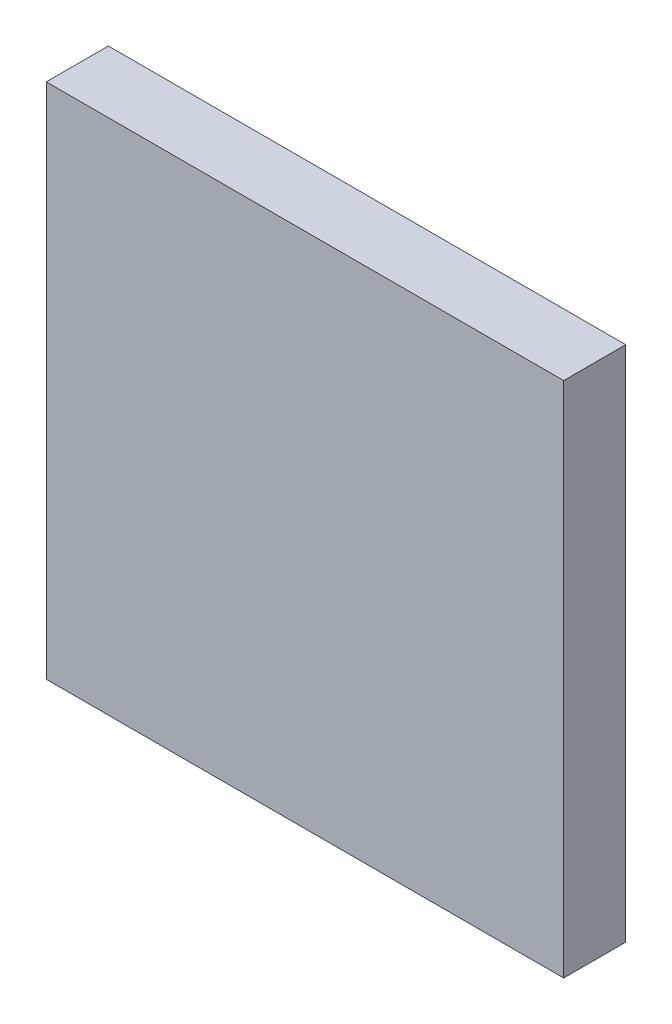
ISO-10303-21;
HEADER;
FILE_DESCRIPTION(('STEP AP214'),'2;1');
FILE_NAME('part.step','',(''),(''),'','','');
FILE_SCHEMA(('AUTOMOTIVE_DESIGN { 1 0 10303 214 1 1 1 1 }'));
ENDSEC;
DATA;
#1=APPLICATION_CONTEXT('core data for automotive mechanical design processes');
#2=APPLICATION_PROTOCOL_DEFINITION('international standard','automotive_design',2000,#1);
#3=PRODUCT_CONTEXT('',#1,'mechanical');
#4=PRODUCT('Part','Part','',(#3));
#5=PRODUCT_RELATED_PRODUCT_CATEGORY('part','',(#4));
#6=PRODUCT_DEFINITION_FORMATION('','',#4);
#7=PRODUCT_DEFINITION_CONTEXT('part definition',#1,'design');
#8=PRODUCT_DEFINITION('design','',#6,#7);
#9=PRODUCT_DEFINITION_SHAPE('','',#8);
#10=(LENGTH_UNIT() NAMED_UNIT(*) SI_UNIT(.MILLI.,.METRE.));
#11=(NAMED_UNIT(*) PLANE_ANGLE_UNIT() SI_UNIT($,.RADIAN.));
#12=(NAMED_UNIT(*) SI_UNIT($,.STERADIAN.) SOLID_ANGLE_UNIT());
#13=UNCERTAINTY_MEASURE_WITH_UNIT(LENGTH_MEASURE(1.E-05),#10,'distance_accuracy_value','');
#14=(GEOMETRIC_REPRESENTATION_CONTEXT(3) GLOBAL_UNCERTAINTY_ASSIGNED_CONTEXT((#13)) GLOBAL_UNIT_ASSIGNED_CONTEXT((#10,
#11,#12)) REPRESENTATION_CONTEXT('',''));
#15=CARTESIAN_POINT('',(0.,0.,0.));
#16=DIRECTION('',(0.,0.,1.));
#17=DIRECTION('',(1.,0.,0.));
#18=AXIS2_PLACEMENT_3D('',#15,#16,#17);
#19=CARTESIAN_POINT('',(0.,0.,3.));
#20=DIRECTION('',(1.,0.,0.));
#21=DIRECTION('',(0.,0.,-1.));
#22=AXIS2_PLACEMENT_3D('',#19,#20,#21);
#23=PLANE('',#22);
#24=DIRECTION('',(0.,-1.,0.));
#25=VECTOR('',#24,1.);
#26=CARTESIAN_POINT('',(0.,0.,0.));
#27=LINE('',#26,#25);
#28=CARTESIAN_POINT('',(0.,0.,0.));
#29=VERTEX_POINT('',#28);
#30=CARTESIAN_POINT('',(0.,-25.,0.));
#31=VERTEX_POINT('',#30);
#32=EDGE_CURVE('E107',#29,#31,#27,.T.);
#33=ORIENTED_EDGE('',*,*,#32,.T.);
#34=DIRECTION('',(0.,0.,-1.));
#35=VECTOR('',#34,1.);
#36=CARTESIAN_POINT('',(0.,-25.,3.));
#37=LINE('',#36,#35);
#38=CARTESIAN_POINT('',(0.,-25.,3.));
#39=VERTEX_POINT('',#38);
#40=EDGE_CURVE('E11',#39,#31,#37,.T.);
#41=ORIENTED_EDGE('',*,*,#40,.F.);
#42=DIRECTION('',(0.,-1.,0.));
#43=VECTOR('',#42,1.);
#44=CARTESIAN_POINT('',(0.,0.,3.));
#45=LINE('',#44,#43);
#46=CARTESIAN_POINT('',(0.,0.,3.));
#47=VERTEX_POINT('',#46);
#48=EDGE_CURVE('E91',#47,#39,#45,.T.);
#49=ORIENTED_EDGE('',*,*,#48,.F.);
#50=DIRECTION('',(0.,0.,-1.));
#51=VECTOR('',#50,1.);
#52=CARTESIAN_POINT('',(0.,0.,3.));
#53=LINE('',#52,#51);
#54=EDGE_CURVE('E103',#47,#29,#53,.T.);
#55=ORIENTED_EDGE('',*,*,#54,.T.);
#56=EDGE_LOOP('',(#33,#41,#49,#55));
#57=FACE_BOUND('',#56,.T.);
#58=ADVANCED_FACE('F39',(#57),#23,.F.);
#59=CARTESIAN_POINT('',(0.,-25.,3.));
#60=DIRECTION('',(0.,1.,0.));
#61=DIRECTION('',(0.,0.,1.));
#62=AXIS2_PLACEMENT_3D('',#59,#60,#61);
#63=PLANE('',#62);
#64=DIRECTION('',(1.,0.,0.));
#65=VECTOR('',#64,1.);
#66=CARTESIAN_POINT('',(0.,-25.,0.));
#67=LINE('',#66,#65);
#68=CARTESIAN_POINT('',(25.,-25.,0.));
#69=VERTEX_POINT('',#68);
#70=EDGE_CURVE('E96',#31,#69,#67,.T.);
#71=ORIENTED_EDGE('',*,*,#70,.T.);
#72=DIRECTION('',(0.,0.,-1.));
#73=VECTOR('',#72,1.);
#74=CARTESIAN_POINT('',(25.,-25.,3.));
#75=LINE('',#74,#73);
#76=CARTESIAN_POINT('',(25.,-25.,3.));
#77=VERTEX_POINT('',#76);
#78=EDGE_CURVE('E48',#77,#69,#75,.T.);
#79=ORIENTED_EDGE('',*,*,#78,.F.);
#80=DIRECTION('',(1.,0.,0.));
#81=VECTOR('',#80,1.);
#82=CARTESIAN_POINT('',(0.,-25.,3.));
#83=LINE('',#82,#81);
#84=EDGE_CURVE('E86',#39,#77,#83,.T.);
#85=ORIENTED_EDGE('',*,*,#84,.F.);
#86=ORIENTED_EDGE('',*,*,#40,.T.);
#87=EDGE_LOOP('',(#71,#79,#85,#86));
#88=FACE_BOUND('',#87,.T.);
#89=ADVANCED_FACE('F95',(#88),#63,.F.);
#90=CARTESIAN_POINT('',(25.,0.,3.));
#91=DIRECTION('',(-1.,0.,0.));
#92=DIRECTION('',(0.,0.,1.));
#93=AXIS2_PLACEMENT_3D('',#90,#91,#92);
#94=PLANE('',#93);
#95=DIRECTION('',(0.,1.,0.));
#96=VECTOR('',#95,1.);
#97=CARTESIAN_POINT('',(25.,0.,0.));
#98=LINE('',#97,#96);
#99=CARTESIAN_POINT('',(25.,0.,0.));
#100=VERTEX_POINT('',#99);
#101=EDGE_CURVE('E73',#69,#100,#98,.T.);
#102=ORIENTED_EDGE('',*,*,#101,.T.);
#103=DIRECTION('',(0.,0.,-1.));
#104=VECTOR('',#103,1.);
#105=CARTESIAN_POINT('',(25.,0.,3.));
#106=LINE('',#105,#104);
#107=CARTESIAN_POINT('',(25.,0.,3.));
#108=VERTEX_POINT('',#107);
#109=EDGE_CURVE('E98',#108,#100,#106,.T.);
#110=ORIENTED_EDGE('',*,*,#109,.F.);
#111=DIRECTION('',(0.,1.,0.));
#112=VECTOR('',#111,1.);
#113=CARTESIAN_POINT('',(25.,0.,3.));
#114=LINE('',#113,#112);
#115=EDGE_CURVE('E89',#77,#108,#114,.T.);
#116=ORIENTED_EDGE('',*,*,#115,.F.);
#117=ORIENTED_EDGE('',*,*,#78,.T.);
#118=EDGE_LOOP('',(#102,#110,#116,#117));
#119=FACE_BOUND('',#118,.T.);
#120=ADVANCED_FACE('F99',(#119),#94,.F.);
#121=CARTESIAN_POINT('',(0.,0.,3.));
#122=DIRECTION('',(0.,-1.,0.));
#123=DIRECTION('',(0.,0.,-1.));
#124=AXIS2_PLACEMENT_3D('',#121,#122,#123);
#125=PLANE('',#124);
#126=DIRECTION('',(-1.,0.,0.));
#127=VECTOR('',#126,1.);
#128=CARTESIAN_POINT('',(0.,0.,0.));
#129=LINE('',#128,#127);
#130=EDGE_CURVE('E79',#100,#29,#129,.T.);
#131=ORIENTED_EDGE('',*,*,#130,.T.);
#132=ORIENTED_EDGE('',*,*,#54,.F.);
#133=DIRECTION('',(-1.,0.,0.));
#134=VECTOR('',#133,1.);
#135=CARTESIAN_POINT('',(0.,0.,3.));
#136=LINE('',#135,#134);
#137=EDGE_CURVE('E56',#108,#47,#136,.T.);
#138=ORIENTED_EDGE('',*,*,#137,.F.);
#139=ORIENTED_EDGE('',*,*,#109,.T.);
#140=EDGE_LOOP('',(#131,#132,#138,#139));
#141=FACE_BOUND('',#140,.T.);
#142=ADVANCED_FACE('F120',(#141),#125,.F.);
#143=CARTESIAN_POINT('',(0.,0.,3.));
#144=DIRECTION('',(0.,0.,1.));
#145=DIRECTION('',(1.,0.,0.));
#146=AXIS2_PLACEMENT_3D('',#143,#144,#145);
#147=PLANE('',#146);
#148=ORIENTED_EDGE('',*,*,#48,.T.);
#149=ORIENTED_EDGE('',*,*,#84,.T.);
#150=ORIENTED_EDGE('',*,*,#115,.T.);
#151=ORIENTED_EDGE('',*,*,#137,.T.);
#152=EDGE_LOOP('',(#148,#149,#150,#151));
#153=FACE_BOUND('',#152,.T.);
#154=ADVANCED_FACE('F87',(#153),#147,.T.);
#155=CARTESIAN_POINT('',(0.,0.,0.));
#156=DIRECTION('',(0.,0.,1.));
#157=DIRECTION('',(1.,0.,0.));
#158=AXIS2_PLACEMENT_3D('',#155,#156,#157);
#159=PLANE('',#158);
#160=ORIENTED_EDGE('',*,*,#32,.F.);
#161=ORIENTED_EDGE('',*,*,#130,.F.);
#162=ORIENTED_EDGE('',*,*,#101,.F.);
#163=ORIENTED_EDGE('',*,*,#70,.F.);
#164=EDGE_LOOP('',(#160,#161,#162,#163));
#165=FACE_BOUND('',#164,.T.);
#166=ADVANCED_FACE('F123',(#165),#159,.F.);
#167=CLOSED_SHELL('',(#58,#89,#120,#142,#154,#166));
#168=MANIFOLD_SOLID_BREP('B2',#167);
#169=ADVANCED_BREP_SHAPE_REPRESENTATION('',(#18,#168),#14);
#170=SHAPE_DEFINITION_REPRESENTATION(#9,#169);
ENDSEC;
END-ISO-10303-21;
